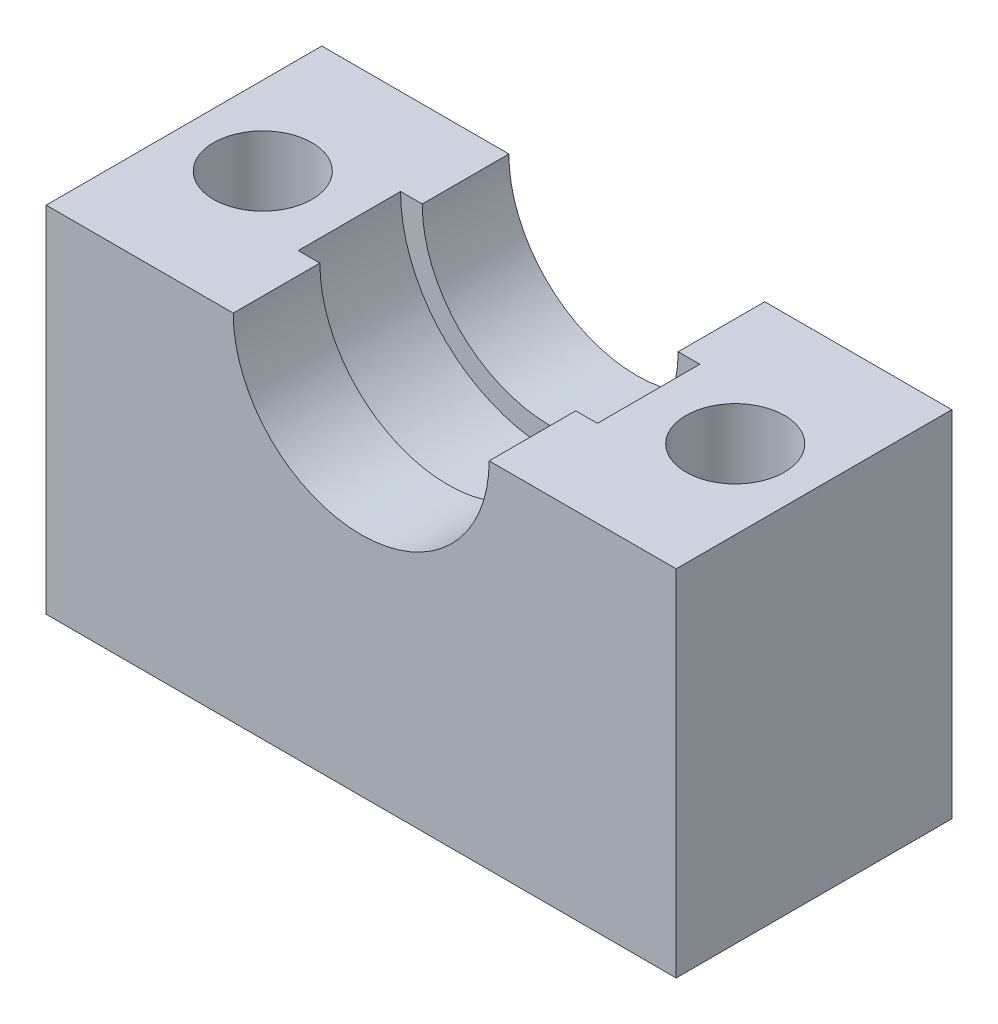
ISO-10303-21;
HEADER;
FILE_DESCRIPTION(('STEP AP214'),'2;1');
FILE_NAME('part.step','',(''),(''),'','','');
FILE_SCHEMA(('AUTOMOTIVE_DESIGN { 1 0 10303 214 1 1 1 1 }'));
ENDSEC;
DATA;
#1=APPLICATION_CONTEXT('core data for automotive mechanical design processes');
#2=APPLICATION_PROTOCOL_DEFINITION('international standard','automotive_design',2000,#1);
#3=PRODUCT_CONTEXT('',#1,'mechanical');
#4=PRODUCT('Part','Part','',(#3));
#5=PRODUCT_RELATED_PRODUCT_CATEGORY('part','',(#4));
#6=PRODUCT_DEFINITION_FORMATION('','',#4);
#7=PRODUCT_DEFINITION_CONTEXT('part definition',#1,'design');
#8=PRODUCT_DEFINITION('design','',#6,#7);
#9=PRODUCT_DEFINITION_SHAPE('','',#8);
#10=(LENGTH_UNIT() NAMED_UNIT(*) SI_UNIT(.MILLI.,.METRE.));
#11=(NAMED_UNIT(*) PLANE_ANGLE_UNIT() SI_UNIT($,.RADIAN.));
#12=(NAMED_UNIT(*) SI_UNIT($,.STERADIAN.) SOLID_ANGLE_UNIT());
#13=UNCERTAINTY_MEASURE_WITH_UNIT(LENGTH_MEASURE(1.E-05),#10,'distance_accuracy_value','');
#14=(GEOMETRIC_REPRESENTATION_CONTEXT(3) GLOBAL_UNCERTAINTY_ASSIGNED_CONTEXT((#13)) GLOBAL_UNIT_ASSIGNED_CONTEXT((#10,
#11,#12)) REPRESENTATION_CONTEXT('',''));
#15=CARTESIAN_POINT('',(0.,0.,0.));
#16=DIRECTION('',(0.,0.,1.));
#17=DIRECTION('',(1.,0.,0.));
#18=AXIS2_PLACEMENT_3D('',#15,#16,#17);
#19=CARTESIAN_POINT('',(0.,18.,0.));
#20=DIRECTION('',(0.,-1.,0.));
#21=DIRECTION('',(0.,0.,-1.));
#22=AXIS2_PLACEMENT_3D('',#19,#20,#21);
#23=PLANE('',#22);
#24=CARTESIAN_POINT('',(12.,18.,0.));
#25=DIRECTION('',(0.,1.,0.));
#26=DIRECTION('',(0.,0.,-1.));
#27=AXIS2_PLACEMENT_3D('',#24,#25,#26);
#28=CIRCLE('',#27,2.5);
#29=CARTESIAN_POINT('',(12.,18.,-2.5));
#30=VERTEX_POINT('',#29);
#31=EDGE_CURVE('E197',#30,#30,#28,.T.);
#32=ORIENTED_EDGE('',*,*,#31,.F.);
#33=EDGE_LOOP('',(#32));
#34=FACE_BOUND('',#33,.T.);
#35=DIRECTION('',(-1.,0.,0.));
#36=VECTOR('',#35,1.);
#37=CARTESIAN_POINT('',(-16.,18.,-7.));
#38=LINE('',#37,#36);
#39=CARTESIAN_POINT('',(16.,18.,-7.));
#40=VERTEX_POINT('',#39);
#41=CARTESIAN_POINT('',(6.5,18.,-7.));
#42=VERTEX_POINT('',#41);
#43=EDGE_CURVE('E124',#40,#42,#38,.T.);
#44=ORIENTED_EDGE('',*,*,#43,.T.);
#45=DIRECTION('',(0.,0.,1.));
#46=VECTOR('',#45,1.);
#47=CARTESIAN_POINT('',(6.5,18.,-7.));
#48=LINE('',#47,#46);
#49=CARTESIAN_POINT('',(6.5,18.,-2.6));
#50=VERTEX_POINT('',#49);
#51=EDGE_CURVE('E109',#42,#50,#48,.T.);
#52=ORIENTED_EDGE('',*,*,#51,.T.);
#53=DIRECTION('',(-1.,0.,0.));
#54=VECTOR('',#53,1.);
#55=CARTESIAN_POINT('',(0.,18.,-2.6));
#56=LINE('',#55,#54);
#57=CARTESIAN_POINT('',(7.6,18.,-2.6));
#58=VERTEX_POINT('',#57);
#59=EDGE_CURVE('E43',#58,#50,#56,.T.);
#60=ORIENTED_EDGE('',*,*,#59,.F.);
#61=DIRECTION('',(0.,0.,1.));
#62=VECTOR('',#61,1.);
#63=CARTESIAN_POINT('',(7.6,18.,-2.6));
#64=LINE('',#63,#62);
#65=CARTESIAN_POINT('',(7.6,18.,2.6));
#66=VERTEX_POINT('',#65);
#67=EDGE_CURVE('E172',#58,#66,#64,.T.);
#68=ORIENTED_EDGE('',*,*,#67,.T.);
#69=DIRECTION('',(-1.,0.,0.));
#70=VECTOR('',#69,1.);
#71=CARTESIAN_POINT('',(0.,18.,2.6));
#72=LINE('',#71,#70);
#73=CARTESIAN_POINT('',(6.5,18.,2.6));
#74=VERTEX_POINT('',#73);
#75=EDGE_CURVE('E166',#66,#74,#72,.T.);
#76=ORIENTED_EDGE('',*,*,#75,.T.);
#77=CARTESIAN_POINT('',(6.5,18.,7.));
#78=VERTEX_POINT('',#77);
#79=EDGE_CURVE('E58',#74,#78,#48,.T.);
#80=ORIENTED_EDGE('',*,*,#79,.T.);
#81=DIRECTION('',(1.,0.,0.));
#82=VECTOR('',#81,1.);
#83=CARTESIAN_POINT('',(-16.,18.,7.));
#84=LINE('',#83,#82);
#85=CARTESIAN_POINT('',(16.,18.,7.));
#86=VERTEX_POINT('',#85);
#87=EDGE_CURVE('E136',#78,#86,#84,.T.);
#88=ORIENTED_EDGE('',*,*,#87,.T.);
#89=DIRECTION('',(0.,0.,-1.));
#90=VECTOR('',#89,1.);
#91=CARTESIAN_POINT('',(16.,18.,7.));
#92=LINE('',#91,#90);
#93=EDGE_CURVE('E132',#86,#40,#92,.T.);
#94=ORIENTED_EDGE('',*,*,#93,.T.);
#95=EDGE_LOOP('',(#44,#52,#60,#68,#76,#80,#88,#94));
#96=FACE_BOUND('',#95,.T.);
#97=ADVANCED_FACE('F35',(#34,#96),#23,.F.);
#98=CARTESIAN_POINT('',(-12.,18.,0.));
#99=DIRECTION('',(0.,1.,0.));
#100=DIRECTION('',(0.,0.,1.));
#101=AXIS2_PLACEMENT_3D('',#98,#99,#100);
#102=CIRCLE('',#101,2.5);
#103=CARTESIAN_POINT('',(-12.,18.,2.5));
#104=VERTEX_POINT('',#103);
#105=EDGE_CURVE('E204',#104,#104,#102,.T.);
#106=ORIENTED_EDGE('',*,*,#105,.F.);
#107=EDGE_LOOP('',(#106));
#108=FACE_BOUND('',#107,.T.);
#109=CARTESIAN_POINT('',(-16.,18.,7.));
#110=VERTEX_POINT('',#109);
#111=CARTESIAN_POINT('',(-6.5,18.,7.));
#112=VERTEX_POINT('',#111);
#113=EDGE_CURVE('E141',#110,#112,#84,.T.);
#114=ORIENTED_EDGE('',*,*,#113,.T.);
#115=DIRECTION('',(0.,0.,1.));
#116=VECTOR('',#115,1.);
#117=CARTESIAN_POINT('',(-6.5,18.,-7.));
#118=LINE('',#117,#116);
#119=CARTESIAN_POINT('',(-6.5,18.,2.6));
#120=VERTEX_POINT('',#119);
#121=EDGE_CURVE('E128',#112,#120,#118,.F.);
#122=ORIENTED_EDGE('',*,*,#121,.T.);
#123=CARTESIAN_POINT('',(-7.6,18.,2.6));
#124=VERTEX_POINT('',#123);
#125=EDGE_CURVE('E165',#120,#124,#72,.T.);
#126=ORIENTED_EDGE('',*,*,#125,.T.);
#127=DIRECTION('',(0.,0.,1.));
#128=VECTOR('',#127,1.);
#129=CARTESIAN_POINT('',(-7.6,18.,-2.6));
#130=LINE('',#129,#128);
#131=CARTESIAN_POINT('',(-7.6,18.,-2.6));
#132=VERTEX_POINT('',#131);
#133=EDGE_CURVE('E169',#124,#132,#130,.F.);
#134=ORIENTED_EDGE('',*,*,#133,.T.);
#135=CARTESIAN_POINT('',(-6.5,18.,-2.6));
#136=VERTEX_POINT('',#135);
#137=EDGE_CURVE('E174',#136,#132,#56,.T.);
#138=ORIENTED_EDGE('',*,*,#137,.F.);
#139=CARTESIAN_POINT('',(-6.5,18.,-7.));
#140=VERTEX_POINT('',#139);
#141=EDGE_CURVE('E50',#136,#140,#118,.F.);
#142=ORIENTED_EDGE('',*,*,#141,.T.);
#143=CARTESIAN_POINT('',(-16.,18.,-7.));
#144=VERTEX_POINT('',#143);
#145=EDGE_CURVE('E127',#140,#144,#38,.T.);
#146=ORIENTED_EDGE('',*,*,#145,.T.);
#147=DIRECTION('',(0.,0.,1.));
#148=VECTOR('',#147,1.);
#149=CARTESIAN_POINT('',(-16.,18.,7.));
#150=LINE('',#149,#148);
#151=EDGE_CURVE('E134',#144,#110,#150,.T.);
#152=ORIENTED_EDGE('',*,*,#151,.T.);
#153=EDGE_LOOP('',(#114,#122,#126,#134,#138,#142,#146,#152));
#154=FACE_BOUND('',#153,.T.);
#155=ADVANCED_FACE('F186',(#108,#154),#23,.F.);
#156=CARTESIAN_POINT('',(16.,18.,7.));
#157=DIRECTION('',(-1.,0.,0.));
#158=DIRECTION('',(0.,0.,1.));
#159=AXIS2_PLACEMENT_3D('',#156,#157,#158);
#160=PLANE('',#159);
#161=DIRECTION('',(0.,0.,-1.));
#162=VECTOR('',#161,1.);
#163=CARTESIAN_POINT('',(16.,0.,7.));
#164=LINE('',#163,#162);
#165=CARTESIAN_POINT('',(16.,0.,7.));
#166=VERTEX_POINT('',#165);
#167=CARTESIAN_POINT('',(16.,0.,-7.));
#168=VERTEX_POINT('',#167);
#169=EDGE_CURVE('E145',#166,#168,#164,.T.);
#170=ORIENTED_EDGE('',*,*,#169,.T.);
#171=DIRECTION('',(0.,-1.,0.));
#172=VECTOR('',#171,1.);
#173=CARTESIAN_POINT('',(16.,18.,-7.));
#174=LINE('',#173,#172);
#175=EDGE_CURVE('E163',#40,#168,#174,.T.);
#176=ORIENTED_EDGE('',*,*,#175,.F.);
#177=ORIENTED_EDGE('',*,*,#93,.F.);
#178=DIRECTION('',(0.,-1.,0.));
#179=VECTOR('',#178,1.);
#180=CARTESIAN_POINT('',(16.,18.,7.));
#181=LINE('',#180,#179);
#182=EDGE_CURVE('E144',#86,#166,#181,.T.);
#183=ORIENTED_EDGE('',*,*,#182,.T.);
#184=EDGE_LOOP('',(#170,#176,#177,#183));
#185=FACE_BOUND('',#184,.T.);
#186=ADVANCED_FACE('F37',(#185),#160,.F.);
#187=CARTESIAN_POINT('',(-16.,18.,-7.));
#188=DIRECTION('',(0.,0.,1.));
#189=DIRECTION('',(1.,0.,0.));
#190=AXIS2_PLACEMENT_3D('',#187,#188,#189);
#191=PLANE('',#190);
#192=ORIENTED_EDGE('',*,*,#145,.F.);
#193=CARTESIAN_POINT('',(0.,18.,-7.));
#194=DIRECTION('',(0.,0.,1.));
#195=DIRECTION('',(1.,0.,0.));
#196=AXIS2_PLACEMENT_3D('',#193,#194,#195);
#197=CIRCLE('',#196,6.5);
#198=EDGE_CURVE('E112',#140,#42,#197,.T.);
#199=ORIENTED_EDGE('',*,*,#198,.T.);
#200=ORIENTED_EDGE('',*,*,#43,.F.);
#201=ORIENTED_EDGE('',*,*,#175,.T.);
#202=DIRECTION('',(-1.,0.,0.));
#203=VECTOR('',#202,1.);
#204=CARTESIAN_POINT('',(-16.,0.,-7.));
#205=LINE('',#204,#203);
#206=CARTESIAN_POINT('',(-16.,0.,-7.));
#207=VERTEX_POINT('',#206);
#208=EDGE_CURVE('E148',#168,#207,#205,.T.);
#209=ORIENTED_EDGE('',*,*,#208,.T.);
#210=DIRECTION('',(0.,-1.,0.));
#211=VECTOR('',#210,1.);
#212=CARTESIAN_POINT('',(-16.,18.,-7.));
#213=LINE('',#212,#211);
#214=EDGE_CURVE('E160',#144,#207,#213,.T.);
#215=ORIENTED_EDGE('',*,*,#214,.F.);
#216=EDGE_LOOP('',(#192,#199,#200,#201,#209,#215));
#217=FACE_BOUND('',#216,.T.);
#218=ADVANCED_FACE('F122',(#217),#191,.F.);
#219=CARTESIAN_POINT('',(-16.,18.,7.));
#220=DIRECTION('',(1.,0.,0.));
#221=DIRECTION('',(0.,0.,-1.));
#222=AXIS2_PLACEMENT_3D('',#219,#220,#221);
#223=PLANE('',#222);
#224=DIRECTION('',(0.,0.,1.));
#225=VECTOR('',#224,1.);
#226=CARTESIAN_POINT('',(-16.,0.,7.));
#227=LINE('',#226,#225);
#228=CARTESIAN_POINT('',(-16.,0.,7.));
#229=VERTEX_POINT('',#228);
#230=EDGE_CURVE('E151',#207,#229,#227,.T.);
#231=ORIENTED_EDGE('',*,*,#230,.T.);
#232=DIRECTION('',(0.,-1.,0.));
#233=VECTOR('',#232,1.);
#234=CARTESIAN_POINT('',(-16.,18.,7.));
#235=LINE('',#234,#233);
#236=EDGE_CURVE('E157',#110,#229,#235,.T.);
#237=ORIENTED_EDGE('',*,*,#236,.F.);
#238=ORIENTED_EDGE('',*,*,#151,.F.);
#239=ORIENTED_EDGE('',*,*,#214,.T.);
#240=EDGE_LOOP('',(#231,#237,#238,#239));
#241=FACE_BOUND('',#240,.T.);
#242=ADVANCED_FACE('F250',(#241),#223,.F.);
#243=CARTESIAN_POINT('',(-16.,18.,7.));
#244=DIRECTION('',(0.,0.,-1.));
#245=DIRECTION('',(-1.,0.,0.));
#246=AXIS2_PLACEMENT_3D('',#243,#244,#245);
#247=PLANE('',#246);
#248=ORIENTED_EDGE('',*,*,#87,.F.);
#249=CARTESIAN_POINT('',(0.,18.,7.));
#250=DIRECTION('',(0.,0.,1.));
#251=DIRECTION('',(1.,0.,0.));
#252=AXIS2_PLACEMENT_3D('',#249,#250,#251);
#253=CIRCLE('',#252,6.5);
#254=EDGE_CURVE('E129',#112,#78,#253,.T.);
#255=ORIENTED_EDGE('',*,*,#254,.F.);
#256=ORIENTED_EDGE('',*,*,#113,.F.);
#257=ORIENTED_EDGE('',*,*,#236,.T.);
#258=DIRECTION('',(1.,0.,0.));
#259=VECTOR('',#258,1.);
#260=CARTESIAN_POINT('',(-16.,0.,7.));
#261=LINE('',#260,#259);
#262=EDGE_CURVE('E153',#229,#166,#261,.T.);
#263=ORIENTED_EDGE('',*,*,#262,.T.);
#264=ORIENTED_EDGE('',*,*,#182,.F.);
#265=EDGE_LOOP('',(#248,#255,#256,#257,#263,#264));
#266=FACE_BOUND('',#265,.T.);
#267=ADVANCED_FACE('F246',(#266),#247,.F.);
#268=CARTESIAN_POINT('',(0.,0.,0.));
#269=DIRECTION('',(0.,-1.,0.));
#270=DIRECTION('',(0.,0.,-1.));
#271=AXIS2_PLACEMENT_3D('',#268,#269,#270);
#272=PLANE('',#271);
#273=CARTESIAN_POINT('',(-12.,0.,0.));
#274=DIRECTION('',(0.,1.,0.));
#275=DIRECTION('',(0.,0.,1.));
#276=AXIS2_PLACEMENT_3D('',#273,#274,#275);
#277=CIRCLE('',#276,2.5);
#278=CARTESIAN_POINT('',(-12.,0.,2.5));
#279=VERTEX_POINT('',#278);
#280=EDGE_CURVE('E215',#279,#279,#277,.T.);
#281=ORIENTED_EDGE('',*,*,#280,.T.);
#282=EDGE_LOOP('',(#281));
#283=FACE_BOUND('',#282,.T.);
#284=CARTESIAN_POINT('',(12.,0.,0.));
#285=DIRECTION('',(0.,1.,0.));
#286=DIRECTION('',(0.,0.,-1.));
#287=AXIS2_PLACEMENT_3D('',#284,#285,#286);
#288=CIRCLE('',#287,2.5);
#289=CARTESIAN_POINT('',(12.,0.,-2.5));
#290=VERTEX_POINT('',#289);
#291=EDGE_CURVE('E209',#290,#290,#288,.T.);
#292=ORIENTED_EDGE('',*,*,#291,.T.);
#293=EDGE_LOOP('',(#292));
#294=FACE_BOUND('',#293,.T.);
#295=ORIENTED_EDGE('',*,*,#169,.F.);
#296=ORIENTED_EDGE('',*,*,#262,.F.);
#297=ORIENTED_EDGE('',*,*,#230,.F.);
#298=ORIENTED_EDGE('',*,*,#208,.F.);
#299=EDGE_LOOP('',(#295,#296,#297,#298));
#300=FACE_BOUND('',#299,.T.);
#301=ADVANCED_FACE('F243',(#283,#294,#300),#272,.T.);
#302=CARTESIAN_POINT('',(0.,18.,-2.6));
#303=DIRECTION('',(0.,0.,1.));
#304=DIRECTION('',(1.,0.,0.));
#305=AXIS2_PLACEMENT_3D('',#302,#303,#304);
#306=CYLINDRICAL_SURFACE('',#305,7.6);
#307=CARTESIAN_POINT('',(0.,18.,-2.6));
#308=DIRECTION('',(0.,0.,1.));
#309=DIRECTION('',(1.,0.,0.));
#310=AXIS2_PLACEMENT_3D('',#307,#308,#309);
#311=CIRCLE('',#310,7.6);
#312=EDGE_CURVE('E149',#132,#58,#311,.T.);
#313=ORIENTED_EDGE('',*,*,#312,.F.);
#314=ORIENTED_EDGE('',*,*,#133,.F.);
#315=CARTESIAN_POINT('',(0.,18.,2.6));
#316=DIRECTION('',(0.,0.,1.));
#317=DIRECTION('',(1.,0.,0.));
#318=AXIS2_PLACEMENT_3D('',#315,#316,#317);
#319=CIRCLE('',#318,7.6);
#320=EDGE_CURVE('E118',#124,#66,#319,.T.);
#321=ORIENTED_EDGE('',*,*,#320,.T.);
#322=ORIENTED_EDGE('',*,*,#67,.F.);
#323=EDGE_LOOP('',(#313,#314,#321,#322));
#324=FACE_BOUND('',#323,.T.);
#325=ADVANCED_FACE('F183',(#324),#306,.F.);
#326=CARTESIAN_POINT('',(0.,18.,-2.6));
#327=DIRECTION('',(0.,0.,1.));
#328=DIRECTION('',(1.,0.,0.));
#329=AXIS2_PLACEMENT_3D('',#326,#327,#328);
#330=PLANE('',#329);
#331=CARTESIAN_POINT('',(0.,18.,-2.6));
#332=DIRECTION('',(0.,0.,1.));
#333=DIRECTION('',(1.,0.,0.));
#334=AXIS2_PLACEMENT_3D('',#331,#332,#333);
#335=CIRCLE('',#334,6.5);
#336=EDGE_CURVE('E113',#136,#50,#335,.T.);
#337=ORIENTED_EDGE('',*,*,#336,.F.);
#338=ORIENTED_EDGE('',*,*,#137,.T.);
#339=ORIENTED_EDGE('',*,*,#312,.T.);
#340=ORIENTED_EDGE('',*,*,#59,.T.);
#341=EDGE_LOOP('',(#337,#338,#339,#340));
#342=FACE_BOUND('',#341,.T.);
#343=ADVANCED_FACE('F179',(#342),#330,.T.);
#344=CARTESIAN_POINT('',(0.,18.,2.6));
#345=DIRECTION('',(0.,0.,1.));
#346=DIRECTION('',(1.,0.,0.));
#347=AXIS2_PLACEMENT_3D('',#344,#345,#346);
#348=PLANE('',#347);
#349=ORIENTED_EDGE('',*,*,#125,.F.);
#350=CARTESIAN_POINT('',(0.,18.,2.6));
#351=DIRECTION('',(0.,0.,1.));
#352=DIRECTION('',(1.,0.,0.));
#353=AXIS2_PLACEMENT_3D('',#350,#351,#352);
#354=CIRCLE('',#353,6.5);
#355=EDGE_CURVE('E11',#120,#74,#354,.T.);
#356=ORIENTED_EDGE('',*,*,#355,.T.);
#357=ORIENTED_EDGE('',*,*,#75,.F.);
#358=ORIENTED_EDGE('',*,*,#320,.F.);
#359=EDGE_LOOP('',(#349,#356,#357,#358));
#360=FACE_BOUND('',#359,.T.);
#361=ADVANCED_FACE('F191',(#360),#348,.F.);
#362=CARTESIAN_POINT('',(0.,18.,-7.));
#363=DIRECTION('',(0.,0.,1.));
#364=DIRECTION('',(1.,0.,0.));
#365=AXIS2_PLACEMENT_3D('',#362,#363,#364);
#366=CYLINDRICAL_SURFACE('',#365,6.5);
#367=ORIENTED_EDGE('',*,*,#355,.F.);
#368=ORIENTED_EDGE('',*,*,#121,.F.);
#369=ORIENTED_EDGE('',*,*,#254,.T.);
#370=ORIENTED_EDGE('',*,*,#79,.F.);
#371=EDGE_LOOP('',(#367,#368,#369,#370));
#372=FACE_BOUND('',#371,.T.);
#373=ADVANCED_FACE('F271',(#372),#366,.F.);
#374=ORIENTED_EDGE('',*,*,#198,.F.);
#375=ORIENTED_EDGE('',*,*,#141,.F.);
#376=ORIENTED_EDGE('',*,*,#336,.T.);
#377=ORIENTED_EDGE('',*,*,#51,.F.);
#378=EDGE_LOOP('',(#374,#375,#376,#377));
#379=FACE_BOUND('',#378,.T.);
#380=ADVANCED_FACE('F111',(#379),#366,.F.);
#381=CARTESIAN_POINT('',(-12.,12.5,0.));
#382=DIRECTION('',(0.,1.,0.));
#383=DIRECTION('',(0.,0.,1.));
#384=AXIS2_PLACEMENT_3D('',#381,#382,#383);
#385=CYLINDRICAL_SURFACE('',#384,2.5);
#386=CARTESIAN_POINT('',(-12.,12.5,0.));
#387=DIRECTION('',(0.,1.,0.));
#388=DIRECTION('',(0.,0.,1.));
#389=AXIS2_PLACEMENT_3D('',#386,#387,#388);
#390=CIRCLE('',#389,2.5);
#391=CARTESIAN_POINT('',(-12.,12.5,2.5));
#392=VERTEX_POINT('',#391);
#393=EDGE_CURVE('E196',#392,#392,#390,.T.);
#394=ORIENTED_EDGE('',*,*,#393,.F.);
#395=EDGE_LOOP('',(#394));
#396=FACE_BOUND('',#395,.T.);
#397=ORIENTED_EDGE('',*,*,#105,.T.);
#398=EDGE_LOOP('',(#397));
#399=FACE_BOUND('',#398,.T.);
#400=ADVANCED_FACE('F278',(#396,#399),#385,.F.);
#401=CARTESIAN_POINT('',(-12.,12.5,0.));
#402=DIRECTION('',(0.,1.,0.));
#403=DIRECTION('',(0.,0.,1.));
#404=AXIS2_PLACEMENT_3D('',#401,#402,#403);
#405=PLANE('',#404);
#406=ORIENTED_EDGE('',*,*,#393,.T.);
#407=EDGE_LOOP('',(#406));
#408=FACE_BOUND('',#407,.T.);
#409=ADVANCED_FACE('F354',(#408),#405,.T.);
#410=CARTESIAN_POINT('',(12.,12.5,0.));
#411=DIRECTION('',(0.,1.,0.));
#412=DIRECTION('',(0.,0.,1.));
#413=AXIS2_PLACEMENT_3D('',#410,#411,#412);
#414=CYLINDRICAL_SURFACE('',#413,2.5);
#415=CARTESIAN_POINT('',(12.,12.5,0.));
#416=DIRECTION('',(0.,1.,0.));
#417=DIRECTION('',(0.,0.,-1.));
#418=AXIS2_PLACEMENT_3D('',#415,#416,#417);
#419=CIRCLE('',#418,2.5);
#420=CARTESIAN_POINT('',(12.,12.5,-2.5));
#421=VERTEX_POINT('',#420);
#422=EDGE_CURVE('E200',#421,#421,#419,.T.);
#423=ORIENTED_EDGE('',*,*,#422,.F.);
#424=EDGE_LOOP('',(#423));
#425=FACE_BOUND('',#424,.T.);
#426=ORIENTED_EDGE('',*,*,#31,.T.);
#427=EDGE_LOOP('',(#426));
#428=FACE_BOUND('',#427,.T.);
#429=ADVANCED_FACE('F281',(#425,#428),#414,.F.);
#430=CARTESIAN_POINT('',(12.,12.5,0.));
#431=DIRECTION('',(0.,-1.,0.));
#432=DIRECTION('',(0.,0.,-1.));
#433=AXIS2_PLACEMENT_3D('',#430,#431,#432);
#434=PLANE('',#433);
#435=ORIENTED_EDGE('',*,*,#422,.T.);
#436=EDGE_LOOP('',(#435));
#437=FACE_BOUND('',#436,.T.);
#438=ADVANCED_FACE('F371',(#437),#434,.F.);
#439=CARTESIAN_POINT('',(12.,5.5,0.));
#440=DIRECTION('',(0.,-1.,0.));
#441=DIRECTION('',(0.,0.,-1.));
#442=AXIS2_PLACEMENT_3D('',#439,#440,#441);
#443=CYLINDRICAL_SURFACE('',#442,2.5);
#444=CARTESIAN_POINT('',(12.,5.5,0.));
#445=DIRECTION('',(0.,1.,0.));
#446=DIRECTION('',(0.,0.,-1.));
#447=AXIS2_PLACEMENT_3D('',#444,#445,#446);
#448=CIRCLE('',#447,2.5);
#449=CARTESIAN_POINT('',(12.,5.5,-2.5));
#450=VERTEX_POINT('',#449);
#451=EDGE_CURVE('E212',#450,#450,#448,.T.);
#452=ORIENTED_EDGE('',*,*,#451,.T.);
#453=EDGE_LOOP('',(#452));
#454=FACE_BOUND('',#453,.T.);
#455=ORIENTED_EDGE('',*,*,#291,.F.);
#456=EDGE_LOOP('',(#455));
#457=FACE_BOUND('',#456,.T.);
#458=ADVANCED_FACE('F378',(#454,#457),#443,.F.);
#459=CARTESIAN_POINT('',(12.,5.5,0.));
#460=DIRECTION('',(0.,1.,0.));
#461=DIRECTION('',(0.,0.,-1.));
#462=AXIS2_PLACEMENT_3D('',#459,#460,#461);
#463=PLANE('',#462);
#464=ORIENTED_EDGE('',*,*,#451,.F.);
#465=EDGE_LOOP('',(#464));
#466=FACE_BOUND('',#465,.T.);
#467=ADVANCED_FACE('F230',(#466),#463,.F.);
#468=CARTESIAN_POINT('',(-12.,5.5,0.));
#469=DIRECTION('',(0.,-1.,0.));
#470=DIRECTION('',(0.,0.,-1.));
#471=AXIS2_PLACEMENT_3D('',#468,#469,#470);
#472=CYLINDRICAL_SURFACE('',#471,2.5);
#473=CARTESIAN_POINT('',(-12.,5.5,0.));
#474=DIRECTION('',(0.,1.,0.));
#475=DIRECTION('',(0.,0.,1.));
#476=AXIS2_PLACEMENT_3D('',#473,#474,#475);
#477=CIRCLE('',#476,2.5);
#478=CARTESIAN_POINT('',(-12.,5.5,2.5));
#479=VERTEX_POINT('',#478);
#480=EDGE_CURVE('E201',#479,#479,#477,.T.);
#481=ORIENTED_EDGE('',*,*,#480,.T.);
#482=EDGE_LOOP('',(#481));
#483=FACE_BOUND('',#482,.T.);
#484=ORIENTED_EDGE('',*,*,#280,.F.);
#485=EDGE_LOOP('',(#484));
#486=FACE_BOUND('',#485,.T.);
#487=ADVANCED_FACE('F221',(#483,#486),#472,.F.);
#488=CARTESIAN_POINT('',(-12.,5.5,0.));
#489=DIRECTION('',(0.,-1.,0.));
#490=DIRECTION('',(0.,0.,1.));
#491=AXIS2_PLACEMENT_3D('',#488,#489,#490);
#492=PLANE('',#491);
#493=ORIENTED_EDGE('',*,*,#480,.F.);
#494=EDGE_LOOP('',(#493));
#495=FACE_BOUND('',#494,.T.);
#496=ADVANCED_FACE('F224',(#495),#492,.T.);
#497=CLOSED_SHELL('',(#97,#155,#186,#218,#242,#267,#301,#325,#343,#361,#373,#380,#400,#409,#429,
#438,#458,#467,#487,#496));
#498=MANIFOLD_SOLID_BREP('B2',#497);
#499=ADVANCED_BREP_SHAPE_REPRESENTATION('',(#18,#498),#14);
#500=SHAPE_DEFINITION_REPRESENTATION(#9,#499);
ENDSEC;
END-ISO-10303-21;
